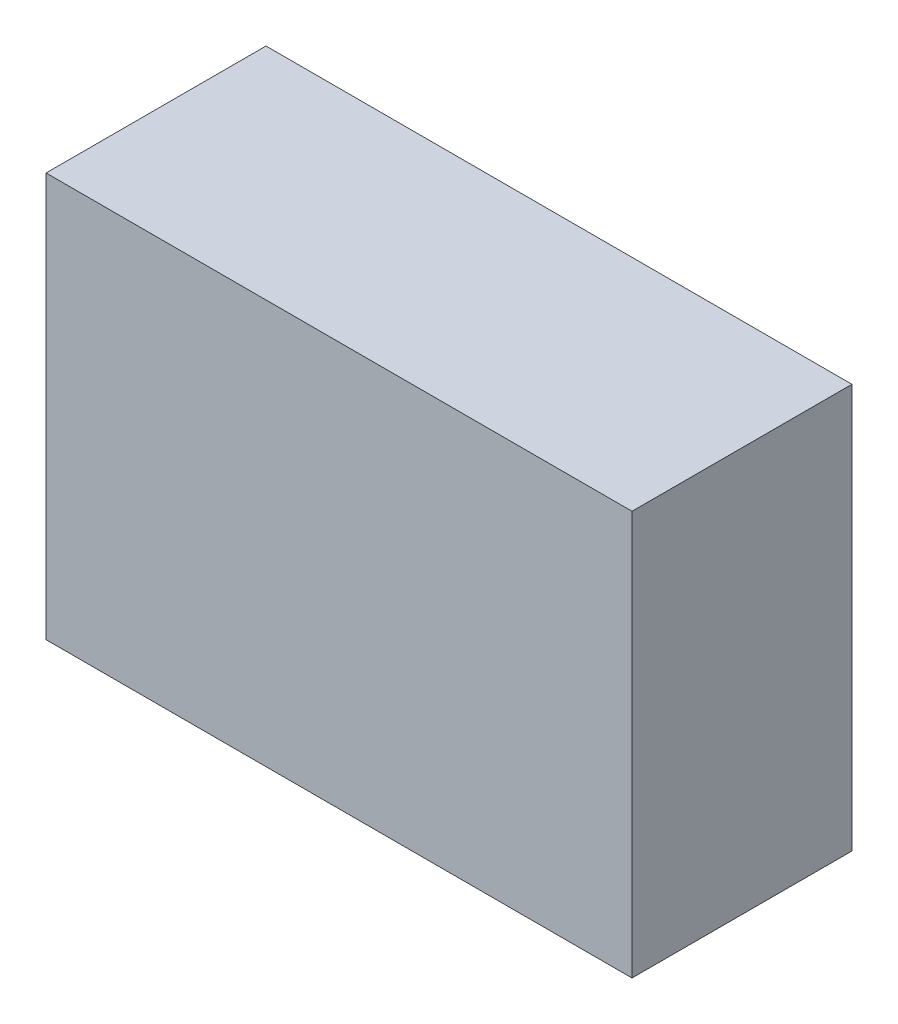
ISO-10303-21;
HEADER;
FILE_DESCRIPTION(('STEP AP214'),'2;1');
FILE_NAME('part.step','',(''),(''),'','','');
FILE_SCHEMA(('AUTOMOTIVE_DESIGN { 1 0 10303 214 1 1 1 1 }'));
ENDSEC;
DATA;
#1=APPLICATION_CONTEXT('core data for automotive mechanical design processes');
#2=APPLICATION_PROTOCOL_DEFINITION('international standard','automotive_design',2000,#1);
#3=PRODUCT_CONTEXT('',#1,'mechanical');
#4=PRODUCT('Part','Part','',(#3));
#5=PRODUCT_RELATED_PRODUCT_CATEGORY('part','',(#4));
#6=PRODUCT_DEFINITION_FORMATION('','',#4);
#7=PRODUCT_DEFINITION_CONTEXT('part definition',#1,'design');
#8=PRODUCT_DEFINITION('design','',#6,#7);
#9=PRODUCT_DEFINITION_SHAPE('','',#8);
#10=(LENGTH_UNIT() NAMED_UNIT(*) SI_UNIT(.MILLI.,.METRE.));
#11=(NAMED_UNIT(*) PLANE_ANGLE_UNIT() SI_UNIT($,.RADIAN.));
#12=(NAMED_UNIT(*) SI_UNIT($,.STERADIAN.) SOLID_ANGLE_UNIT());
#13=UNCERTAINTY_MEASURE_WITH_UNIT(LENGTH_MEASURE(1.E-05),#10,'distance_accuracy_value','');
#14=(GEOMETRIC_REPRESENTATION_CONTEXT(3) GLOBAL_UNCERTAINTY_ASSIGNED_CONTEXT((#13)) GLOBAL_UNIT_ASSIGNED_CONTEXT((#10,
#11,#12)) REPRESENTATION_CONTEXT('',''));
#15=CARTESIAN_POINT('',(0.,0.,0.));
#16=DIRECTION('',(0.,0.,1.));
#17=DIRECTION('',(1.,0.,0.));
#18=AXIS2_PLACEMENT_3D('',#15,#16,#17);
#19=CARTESIAN_POINT('',(-29.0322,20.0279,21.7932));
#20=DIRECTION('',(1.,0.,0.));
#21=DIRECTION('',(0.,0.,-1.));
#22=AXIS2_PLACEMENT_3D('',#19,#20,#21);
#23=PLANE('',#22);
#24=DIRECTION('',(0.,-1.,0.));
#25=VECTOR('',#24,1.);
#26=CARTESIAN_POINT('',(-29.0322,20.0279,0.));
#27=LINE('',#26,#25);
#28=CARTESIAN_POINT('',(-29.0322,20.0279,0.));
#29=VERTEX_POINT('',#28);
#30=CARTESIAN_POINT('',(-29.0322,-20.0279,0.));
#31=VERTEX_POINT('',#30);
#32=EDGE_CURVE('E95',#29,#31,#27,.T.);
#33=ORIENTED_EDGE('',*,*,#32,.T.);
#34=DIRECTION('',(0.,0.,-1.));
#35=VECTOR('',#34,1.);
#36=CARTESIAN_POINT('',(-29.0322,-20.0279,21.7932));
#37=LINE('',#36,#35);
#38=CARTESIAN_POINT('',(-29.0322,-20.0279,21.7932));
#39=VERTEX_POINT('',#38);
#40=EDGE_CURVE('E11',#39,#31,#37,.T.);
#41=ORIENTED_EDGE('',*,*,#40,.F.);
#42=DIRECTION('',(0.,-1.,0.));
#43=VECTOR('',#42,1.);
#44=CARTESIAN_POINT('',(-29.0322,20.0279,21.7932));
#45=LINE('',#44,#43);
#46=CARTESIAN_POINT('',(-29.0322,20.0279,21.7932));
#47=VERTEX_POINT('',#46);
#48=EDGE_CURVE('E83',#47,#39,#45,.T.);
#49=ORIENTED_EDGE('',*,*,#48,.F.);
#50=DIRECTION('',(0.,0.,-1.));
#51=VECTOR('',#50,1.);
#52=CARTESIAN_POINT('',(-29.0322,20.0279,21.7932));
#53=LINE('',#52,#51);
#54=EDGE_CURVE('E91',#47,#29,#53,.T.);
#55=ORIENTED_EDGE('',*,*,#54,.T.);
#56=EDGE_LOOP('',(#33,#41,#49,#55));
#57=FACE_BOUND('',#56,.T.);
#58=ADVANCED_FACE('F32',(#57),#23,.F.);
#59=CARTESIAN_POINT('',(29.0322,-20.0279,21.7932));
#60=DIRECTION('',(0.,1.,0.));
#61=DIRECTION('',(-1.,0.,0.));
#62=AXIS2_PLACEMENT_3D('',#59,#60,#61);
#63=PLANE('',#62);
#64=DIRECTION('',(1.,0.,0.));
#65=VECTOR('',#64,1.);
#66=CARTESIAN_POINT('',(29.0322,-20.0279,0.));
#67=LINE('',#66,#65);
#68=CARTESIAN_POINT('',(29.0322,-20.0279,0.));
#69=VERTEX_POINT('',#68);
#70=EDGE_CURVE('E87',#31,#69,#67,.T.);
#71=ORIENTED_EDGE('',*,*,#70,.T.);
#72=DIRECTION('',(0.,0.,-1.));
#73=VECTOR('',#72,1.);
#74=CARTESIAN_POINT('',(29.0322,-20.0279,21.7932));
#75=LINE('',#74,#73);
#76=CARTESIAN_POINT('',(29.0322,-20.0279,21.7932));
#77=VERTEX_POINT('',#76);
#78=EDGE_CURVE('E40',#77,#69,#75,.T.);
#79=ORIENTED_EDGE('',*,*,#78,.F.);
#80=DIRECTION('',(1.,0.,0.));
#81=VECTOR('',#80,1.);
#82=CARTESIAN_POINT('',(29.0322,-20.0279,21.7932));
#83=LINE('',#82,#81);
#84=EDGE_CURVE('E78',#39,#77,#83,.T.);
#85=ORIENTED_EDGE('',*,*,#84,.F.);
#86=ORIENTED_EDGE('',*,*,#40,.T.);
#87=EDGE_LOOP('',(#71,#79,#85,#86));
#88=FACE_BOUND('',#87,.T.);
#89=ADVANCED_FACE('F86',(#88),#63,.F.);
#90=CARTESIAN_POINT('',(29.0322,20.0279,21.7932));
#91=DIRECTION('',(-1.,0.,0.));
#92=DIRECTION('',(0.,0.,1.));
#93=AXIS2_PLACEMENT_3D('',#90,#91,#92);
#94=PLANE('',#93);
#95=DIRECTION('',(0.,1.,0.));
#96=VECTOR('',#95,1.);
#97=CARTESIAN_POINT('',(29.0322,20.0279,0.));
#98=LINE('',#97,#96);
#99=CARTESIAN_POINT('',(29.0322,20.0279,0.));
#100=VERTEX_POINT('',#99);
#101=EDGE_CURVE('E65',#69,#100,#98,.T.);
#102=ORIENTED_EDGE('',*,*,#101,.T.);
#103=DIRECTION('',(0.,0.,-1.));
#104=VECTOR('',#103,1.);
#105=CARTESIAN_POINT('',(29.0322,20.0279,21.7932));
#106=LINE('',#105,#104);
#107=CARTESIAN_POINT('',(29.0322,20.0279,21.7932));
#108=VERTEX_POINT('',#107);
#109=EDGE_CURVE('E88',#108,#100,#106,.T.);
#110=ORIENTED_EDGE('',*,*,#109,.F.);
#111=DIRECTION('',(0.,1.,0.));
#112=VECTOR('',#111,1.);
#113=CARTESIAN_POINT('',(29.0322,20.0279,21.7932));
#114=LINE('',#113,#112);
#115=EDGE_CURVE('E81',#77,#108,#114,.T.);
#116=ORIENTED_EDGE('',*,*,#115,.F.);
#117=ORIENTED_EDGE('',*,*,#78,.T.);
#118=EDGE_LOOP('',(#102,#110,#116,#117));
#119=FACE_BOUND('',#118,.T.);
#120=ADVANCED_FACE('F89',(#119),#94,.F.);
#121=CARTESIAN_POINT('',(29.0322,20.0279,21.7932));
#122=DIRECTION('',(0.,-1.,0.));
#123=DIRECTION('',(1.,0.,0.));
#124=AXIS2_PLACEMENT_3D('',#121,#122,#123);
#125=PLANE('',#124);
#126=DIRECTION('',(-1.,0.,0.));
#127=VECTOR('',#126,1.);
#128=CARTESIAN_POINT('',(29.0322,20.0279,0.));
#129=LINE('',#128,#127);
#130=EDGE_CURVE('E71',#100,#29,#129,.T.);
#131=ORIENTED_EDGE('',*,*,#130,.T.);
#132=ORIENTED_EDGE('',*,*,#54,.F.);
#133=DIRECTION('',(-1.,0.,0.));
#134=VECTOR('',#133,1.);
#135=CARTESIAN_POINT('',(29.0322,20.0279,21.7932));
#136=LINE('',#135,#134);
#137=EDGE_CURVE('E48',#108,#47,#136,.T.);
#138=ORIENTED_EDGE('',*,*,#137,.F.);
#139=ORIENTED_EDGE('',*,*,#109,.T.);
#140=EDGE_LOOP('',(#131,#132,#138,#139));
#141=FACE_BOUND('',#140,.T.);
#142=ADVANCED_FACE('F102',(#141),#125,.F.);
#143=CARTESIAN_POINT('',(0.,0.,21.7932));
#144=DIRECTION('',(0.,0.,-1.));
#145=DIRECTION('',(-1.,0.,0.));
#146=AXIS2_PLACEMENT_3D('',#143,#144,#145);
#147=PLANE('',#146);
#148=ORIENTED_EDGE('',*,*,#48,.T.);
#149=ORIENTED_EDGE('',*,*,#84,.T.);
#150=ORIENTED_EDGE('',*,*,#115,.T.);
#151=ORIENTED_EDGE('',*,*,#137,.T.);
#152=EDGE_LOOP('',(#148,#149,#150,#151));
#153=FACE_BOUND('',#152,.T.);
#154=ADVANCED_FACE('F79',(#153),#147,.F.);
#155=CARTESIAN_POINT('',(0.,0.,0.));
#156=DIRECTION('',(0.,0.,-1.));
#157=DIRECTION('',(-1.,0.,0.));
#158=AXIS2_PLACEMENT_3D('',#155,#156,#157);
#159=PLANE('',#158);
#160=ORIENTED_EDGE('',*,*,#32,.F.);
#161=ORIENTED_EDGE('',*,*,#130,.F.);
#162=ORIENTED_EDGE('',*,*,#101,.F.);
#163=ORIENTED_EDGE('',*,*,#70,.F.);
#164=EDGE_LOOP('',(#160,#161,#162,#163));
#165=FACE_BOUND('',#164,.T.);
#166=ADVANCED_FACE('F105',(#165),#159,.T.);
#167=CLOSED_SHELL('',(#58,#89,#120,#142,#154,#166));
#168=MANIFOLD_SOLID_BREP('B2',#167);
#169=ADVANCED_BREP_SHAPE_REPRESENTATION('',(#18,#168),#14);
#170=SHAPE_DEFINITION_REPRESENTATION(#9,#169);
ENDSEC;
END-ISO-10303-21;
